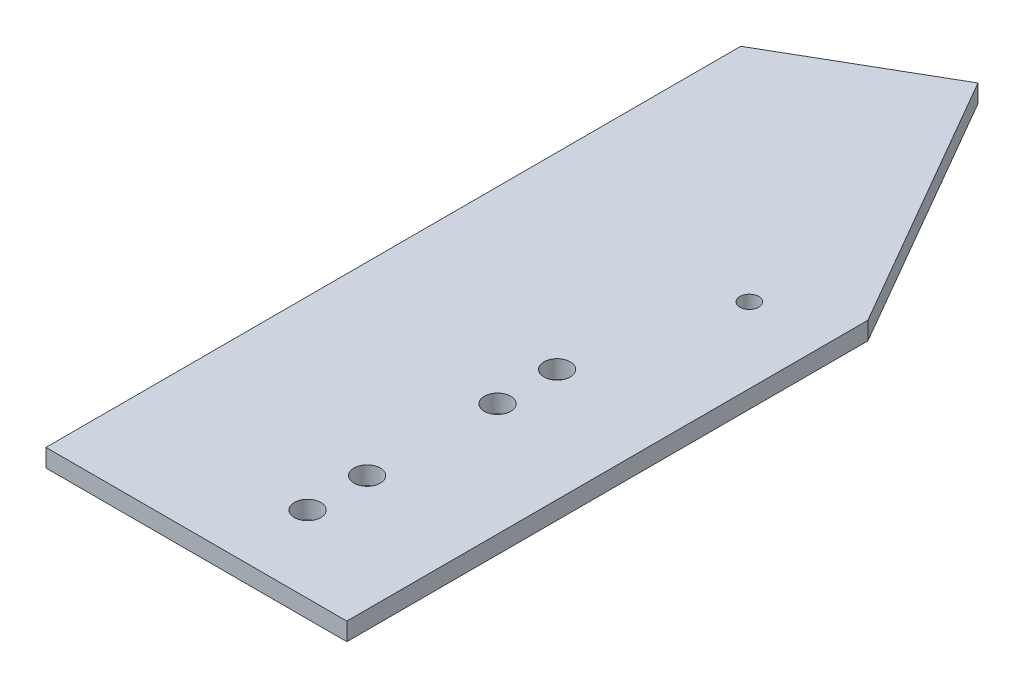
ISO-10303-21;
HEADER;
FILE_DESCRIPTION(('STEP AP214'),'2;1');
FILE_NAME('part.step','',(''),(''),'','','');
FILE_SCHEMA(('AUTOMOTIVE_DESIGN { 1 0 10303 214 1 1 1 1 }'));
ENDSEC;
DATA;
#1=APPLICATION_CONTEXT('core data for automotive mechanical design processes');
#2=APPLICATION_PROTOCOL_DEFINITION('international standard','automotive_design',2000,#1);
#3=PRODUCT_CONTEXT('',#1,'mechanical');
#4=PRODUCT('Part','Part','',(#3));
#5=PRODUCT_RELATED_PRODUCT_CATEGORY('part','',(#4));
#6=PRODUCT_DEFINITION_FORMATION('','',#4);
#7=PRODUCT_DEFINITION_CONTEXT('part definition',#1,'design');
#8=PRODUCT_DEFINITION('design','',#6,#7);
#9=PRODUCT_DEFINITION_SHAPE('','',#8);
#10=(LENGTH_UNIT() NAMED_UNIT(*) SI_UNIT(.MILLI.,.METRE.));
#11=(NAMED_UNIT(*) PLANE_ANGLE_UNIT() SI_UNIT($,.RADIAN.));
#12=(NAMED_UNIT(*) SI_UNIT($,.STERADIAN.) SOLID_ANGLE_UNIT());
#13=UNCERTAINTY_MEASURE_WITH_UNIT(LENGTH_MEASURE(1.E-05),#10,'distance_accuracy_value','');
#14=(GEOMETRIC_REPRESENTATION_CONTEXT(3) GLOBAL_UNCERTAINTY_ASSIGNED_CONTEXT((#13)) GLOBAL_UNIT_ASSIGNED_CONTEXT((#10,
#11,#12)) REPRESENTATION_CONTEXT('',''));
#15=CARTESIAN_POINT('',(0.,0.,0.));
#16=DIRECTION('',(0.,0.,1.));
#17=DIRECTION('',(1.,0.,0.));
#18=AXIS2_PLACEMENT_3D('',#15,#16,#17);
#19=CARTESIAN_POINT('',(-120.,1.19,0.));
#20=DIRECTION('',(1.,0.,0.));
#21=DIRECTION('',(0.,0.,-1.));
#22=AXIS2_PLACEMENT_3D('',#19,#20,#21);
#23=PLANE('',#22);
#24=DIRECTION('',(0.,0.,1.));
#25=VECTOR('',#24,1.);
#26=CARTESIAN_POINT('',(-120.,0.,0.));
#27=LINE('',#26,#25);
#28=CARTESIAN_POINT('',(-120.,0.,-101.691));
#29=VERTEX_POINT('',#28);
#30=CARTESIAN_POINT('',(-120.,0.,-55.5));
#31=VERTEX_POINT('',#30);
#32=EDGE_CURVE('E145',#29,#31,#27,.T.);
#33=ORIENTED_EDGE('',*,*,#32,.T.);
#34=DIRECTION('',(0.,-1.,0.));
#35=VECTOR('',#34,1.);
#36=CARTESIAN_POINT('',(-120.,1.19,-55.5));
#37=LINE('',#36,#35);
#38=CARTESIAN_POINT('',(-120.,1.19,-55.5));
#39=VERTEX_POINT('',#38);
#40=EDGE_CURVE('E11',#39,#31,#37,.T.);
#41=ORIENTED_EDGE('',*,*,#40,.F.);
#42=DIRECTION('',(0.,0.,1.));
#43=VECTOR('',#42,1.);
#44=CARTESIAN_POINT('',(-120.,1.19,0.));
#45=LINE('',#44,#43);
#46=CARTESIAN_POINT('',(-120.,1.19,-101.691));
#47=VERTEX_POINT('',#46);
#48=EDGE_CURVE('E169',#47,#39,#45,.T.);
#49=ORIENTED_EDGE('',*,*,#48,.F.);
#50=DIRECTION('',(0.,-1.,0.));
#51=VECTOR('',#50,1.);
#52=CARTESIAN_POINT('',(-120.,1.19,-101.691));
#53=LINE('',#52,#51);
#54=EDGE_CURVE('E121',#47,#29,#53,.T.);
#55=ORIENTED_EDGE('',*,*,#54,.T.);
#56=EDGE_LOOP('',(#33,#41,#49,#55));
#57=FACE_BOUND('',#56,.T.);
#58=ADVANCED_FACE('F45',(#57),#23,.F.);
#59=CARTESIAN_POINT('',(0.,1.19,-55.5));
#60=DIRECTION('',(0.,0.,-1.));
#61=DIRECTION('',(-1.,0.,0.));
#62=AXIS2_PLACEMENT_3D('',#59,#60,#61);
#63=PLANE('',#62);
#64=DIRECTION('',(1.,0.,0.));
#65=VECTOR('',#64,1.);
#66=CARTESIAN_POINT('',(0.,0.,-55.5));
#67=LINE('',#66,#65);
#68=CARTESIAN_POINT('',(-100.,0.,-55.5));
#69=VERTEX_POINT('',#68);
#70=EDGE_CURVE('E149',#31,#69,#67,.T.);
#71=ORIENTED_EDGE('',*,*,#70,.T.);
#72=DIRECTION('',(0.,-1.,0.));
#73=VECTOR('',#72,1.);
#74=CARTESIAN_POINT('',(-100.,1.19,-55.5));
#75=LINE('',#74,#73);
#76=CARTESIAN_POINT('',(-100.,1.19,-55.5));
#77=VERTEX_POINT('',#76);
#78=EDGE_CURVE('E55',#77,#69,#75,.T.);
#79=ORIENTED_EDGE('',*,*,#78,.F.);
#80=DIRECTION('',(1.,0.,0.));
#81=VECTOR('',#80,1.);
#82=CARTESIAN_POINT('',(0.,1.19,-55.5));
#83=LINE('',#82,#81);
#84=EDGE_CURVE('E97',#39,#77,#83,.T.);
#85=ORIENTED_EDGE('',*,*,#84,.F.);
#86=ORIENTED_EDGE('',*,*,#40,.T.);
#87=EDGE_LOOP('',(#71,#79,#85,#86));
#88=FACE_BOUND('',#87,.T.);
#89=ADVANCED_FACE('F184',(#88),#63,.F.);
#90=CARTESIAN_POINT('',(-100.,1.19,0.));
#91=DIRECTION('',(-1.,0.,0.));
#92=DIRECTION('',(0.,0.,1.));
#93=AXIS2_PLACEMENT_3D('',#90,#91,#92);
#94=PLANE('',#93);
#95=DIRECTION('',(0.,0.,-1.));
#96=VECTOR('',#95,1.);
#97=CARTESIAN_POINT('',(-100.,0.,0.));
#98=LINE('',#97,#96);
#99=CARTESIAN_POINT('',(-100.,0.,-90.144));
#100=VERTEX_POINT('',#99);
#101=EDGE_CURVE('E113',#69,#100,#98,.T.);
#102=ORIENTED_EDGE('',*,*,#101,.T.);
#103=DIRECTION('',(0.,-1.,0.));
#104=VECTOR('',#103,1.);
#105=CARTESIAN_POINT('',(-100.,1.19,-90.144));
#106=LINE('',#105,#104);
#107=CARTESIAN_POINT('',(-100.,1.19,-90.144));
#108=VERTEX_POINT('',#107);
#109=EDGE_CURVE('E110',#108,#100,#106,.T.);
#110=ORIENTED_EDGE('',*,*,#109,.F.);
#111=DIRECTION('',(0.,0.,-1.));
#112=VECTOR('',#111,1.);
#113=CARTESIAN_POINT('',(-100.,1.19,0.));
#114=LINE('',#113,#112);
#115=EDGE_CURVE('E101',#77,#108,#114,.T.);
#116=ORIENTED_EDGE('',*,*,#115,.F.);
#117=ORIENTED_EDGE('',*,*,#78,.T.);
#118=EDGE_LOOP('',(#102,#110,#116,#117));
#119=FACE_BOUND('',#118,.T.);
#120=ADVANCED_FACE('F111',(#119),#94,.F.);
#121=CARTESIAN_POINT('',(-35.9648304525399,1.19,20.7649136562009));
#122=DIRECTION('',(-0.866019052628739,0.,0.500011000363013));
#123=DIRECTION('',(0.500011000363013,0.,0.866019052628739));
#124=AXIS2_PLACEMENT_3D('',#121,#122,#123);
#125=PLANE('',#124);
#126=DIRECTION('',(-0.500011000363013,0.,-0.866019052628739));
#127=VECTOR('',#126,1.);
#128=CARTESIAN_POINT('',(-35.9648304525399,0.,20.7649136562009));
#129=LINE('',#128,#127);
#130=CARTESIAN_POINT('',(-110.,0.,-107.464));
#131=VERTEX_POINT('',#130);
#132=EDGE_CURVE('E83',#100,#131,#129,.T.);
#133=ORIENTED_EDGE('',*,*,#132,.T.);
#134=DIRECTION('',(0.,-1.,0.));
#135=VECTOR('',#134,1.);
#136=CARTESIAN_POINT('',(-110.,1.19,-107.464));
#137=LINE('',#136,#135);
#138=CARTESIAN_POINT('',(-110.,1.19,-107.464));
#139=VERTEX_POINT('',#138);
#140=EDGE_CURVE('E115',#139,#131,#137,.T.);
#141=ORIENTED_EDGE('',*,*,#140,.F.);
#142=DIRECTION('',(-0.500011000363013,0.,-0.866019052628739));
#143=VECTOR('',#142,1.);
#144=CARTESIAN_POINT('',(-35.9648304525399,1.19,20.7649136562009));
#145=LINE('',#144,#143);
#146=EDGE_CURVE('E105',#108,#139,#145,.T.);
#147=ORIENTED_EDGE('',*,*,#146,.F.);
#148=ORIENTED_EDGE('',*,*,#109,.T.);
#149=EDGE_LOOP('',(#133,#141,#147,#148));
#150=FACE_BOUND('',#149,.T.);
#151=ADVANCED_FACE('F117',(#150),#125,.F.);
#152=CARTESIAN_POINT('',(-107.7,1.19,-64.55));
#153=DIRECTION('',(0.,-1.,0.));
#154=DIRECTION('',(0.,0.,-1.));
#155=AXIS2_PLACEMENT_3D('',#152,#153,#154);
#156=CYLINDRICAL_SURFACE('',#155,0.875000000000005);
#157=CARTESIAN_POINT('',(-107.7,1.19,-64.55));
#158=DIRECTION('',(0.,1.,0.));
#159=DIRECTION('',(0.,0.,1.));
#160=AXIS2_PLACEMENT_3D('',#157,#158,#159);
#161=CIRCLE('',#160,0.875000000000005);
#162=CARTESIAN_POINT('',(-107.7,1.19,-63.675));
#163=VERTEX_POINT('',#162);
#164=EDGE_CURVE('E309',#163,#163,#161,.T.);
#165=ORIENTED_EDGE('',*,*,#164,.T.);
#166=EDGE_LOOP('',(#165));
#167=FACE_BOUND('',#166,.T.);
#168=CARTESIAN_POINT('',(-107.7,0.,-64.55));
#169=DIRECTION('',(0.,1.,0.));
#170=DIRECTION('',(0.,0.,1.));
#171=AXIS2_PLACEMENT_3D('',#168,#169,#170);
#172=CIRCLE('',#171,0.875000000000005);
#173=CARTESIAN_POINT('',(-107.7,0.,-63.675));
#174=VERTEX_POINT('',#173);
#175=EDGE_CURVE('E141',#174,#174,#172,.T.);
#176=ORIENTED_EDGE('',*,*,#175,.F.);
#177=EDGE_LOOP('',(#176));
#178=FACE_BOUND('',#177,.T.);
#179=ADVANCED_FACE('F192',(#167,#178),#156,.F.);
#180=CARTESIAN_POINT('',(-107.5,1.19,-76.98));
#181=DIRECTION('',(0.,-1.,0.));
#182=DIRECTION('',(0.,0.,-1.));
#183=AXIS2_PLACEMENT_3D('',#180,#181,#182);
#184=CYLINDRICAL_SURFACE('',#183,0.875000000000005);
#185=CARTESIAN_POINT('',(-107.5,1.19,-76.98));
#186=DIRECTION('',(0.,1.,0.));
#187=DIRECTION('',(0.,0.,1.));
#188=AXIS2_PLACEMENT_3D('',#185,#186,#187);
#189=CIRCLE('',#188,0.875000000000005);
#190=CARTESIAN_POINT('',(-107.5,1.19,-76.105));
#191=VERTEX_POINT('',#190);
#192=EDGE_CURVE('E301',#191,#191,#189,.T.);
#193=ORIENTED_EDGE('',*,*,#192,.T.);
#194=EDGE_LOOP('',(#193));
#195=FACE_BOUND('',#194,.T.);
#196=CARTESIAN_POINT('',(-107.5,0.,-76.98));
#197=DIRECTION('',(0.,1.,0.));
#198=DIRECTION('',(0.,0.,1.));
#199=AXIS2_PLACEMENT_3D('',#196,#197,#198);
#200=CIRCLE('',#199,0.875000000000005);
#201=CARTESIAN_POINT('',(-107.5,0.,-76.105));
#202=VERTEX_POINT('',#201);
#203=EDGE_CURVE('E137',#202,#202,#200,.T.);
#204=ORIENTED_EDGE('',*,*,#203,.F.);
#205=EDGE_LOOP('',(#204));
#206=FACE_BOUND('',#205,.T.);
#207=ADVANCED_FACE('F195',(#195,#206),#184,.F.);
#208=CARTESIAN_POINT('',(-107.7,1.19,-60.59));
#209=DIRECTION('',(0.,-1.,0.));
#210=DIRECTION('',(0.,0.,-1.));
#211=AXIS2_PLACEMENT_3D('',#208,#209,#210);
#212=CYLINDRICAL_SURFACE('',#211,0.875000000000005);
#213=CARTESIAN_POINT('',(-107.7,1.19,-60.59));
#214=DIRECTION('',(0.,1.,0.));
#215=DIRECTION('',(0.,0.,1.));
#216=AXIS2_PLACEMENT_3D('',#213,#214,#215);
#217=CIRCLE('',#216,0.875000000000005);
#218=CARTESIAN_POINT('',(-107.7,1.19,-59.715));
#219=VERTEX_POINT('',#218);
#220=EDGE_CURVE('E296',#219,#219,#217,.T.);
#221=ORIENTED_EDGE('',*,*,#220,.T.);
#222=EDGE_LOOP('',(#221));
#223=FACE_BOUND('',#222,.T.);
#224=CARTESIAN_POINT('',(-107.7,0.,-60.59));
#225=DIRECTION('',(0.,1.,0.));
#226=DIRECTION('',(0.,0.,1.));
#227=AXIS2_PLACEMENT_3D('',#224,#225,#226);
#228=CIRCLE('',#227,0.875000000000005);
#229=CARTESIAN_POINT('',(-107.7,0.,-59.715));
#230=VERTEX_POINT('',#229);
#231=EDGE_CURVE('E133',#230,#230,#228,.T.);
#232=ORIENTED_EDGE('',*,*,#231,.F.);
#233=EDGE_LOOP('',(#232));
#234=FACE_BOUND('',#233,.T.);
#235=ADVANCED_FACE('F199',(#223,#234),#212,.F.);
#236=CARTESIAN_POINT('',(-105.,1.19,-87.26));
#237=DIRECTION('',(0.,-1.,0.));
#238=DIRECTION('',(0.,0.,-1.));
#239=AXIS2_PLACEMENT_3D('',#236,#237,#238);
#240=CYLINDRICAL_SURFACE('',#239,0.625000000000006);
#241=CARTESIAN_POINT('',(-105.,1.19,-87.26));
#242=DIRECTION('',(0.,1.,0.));
#243=DIRECTION('',(0.,0.,1.));
#244=AXIS2_PLACEMENT_3D('',#241,#242,#243);
#245=CIRCLE('',#244,0.625000000000006);
#246=CARTESIAN_POINT('',(-105.,1.19,-86.635));
#247=VERTEX_POINT('',#246);
#248=EDGE_CURVE('E210',#247,#247,#245,.T.);
#249=ORIENTED_EDGE('',*,*,#248,.T.);
#250=EDGE_LOOP('',(#249));
#251=FACE_BOUND('',#250,.T.);
#252=CARTESIAN_POINT('',(-105.,0.,-87.26));
#253=DIRECTION('',(0.,1.,0.));
#254=DIRECTION('',(0.,0.,1.));
#255=AXIS2_PLACEMENT_3D('',#252,#253,#254);
#256=CIRCLE('',#255,0.625000000000006);
#257=CARTESIAN_POINT('',(-105.,0.,-86.635));
#258=VERTEX_POINT('',#257);
#259=EDGE_CURVE('E129',#258,#258,#256,.T.);
#260=ORIENTED_EDGE('',*,*,#259,.F.);
#261=EDGE_LOOP('',(#260));
#262=FACE_BOUND('',#261,.T.);
#263=ADVANCED_FACE('F179',(#251,#262),#240,.F.);
#264=CARTESIAN_POINT('',(-107.5,1.19,-73.02));
#265=DIRECTION('',(0.,-1.,0.));
#266=DIRECTION('',(0.,0.,-1.));
#267=AXIS2_PLACEMENT_3D('',#264,#265,#266);
#268=CYLINDRICAL_SURFACE('',#267,0.875000000000005);
#269=CARTESIAN_POINT('',(-107.5,1.19,-73.02));
#270=DIRECTION('',(0.,1.,0.));
#271=DIRECTION('',(0.,0.,1.));
#272=AXIS2_PLACEMENT_3D('',#269,#270,#271);
#273=CIRCLE('',#272,0.875000000000005);
#274=CARTESIAN_POINT('',(-107.5,1.19,-72.145));
#275=VERTEX_POINT('',#274);
#276=EDGE_CURVE('E158',#275,#275,#273,.T.);
#277=ORIENTED_EDGE('',*,*,#276,.T.);
#278=EDGE_LOOP('',(#277));
#279=FACE_BOUND('',#278,.T.);
#280=CARTESIAN_POINT('',(-107.5,0.,-73.02));
#281=DIRECTION('',(0.,1.,0.));
#282=DIRECTION('',(0.,0.,1.));
#283=AXIS2_PLACEMENT_3D('',#280,#281,#282);
#284=CIRCLE('',#283,0.875000000000005);
#285=CARTESIAN_POINT('',(-107.5,0.,-72.145));
#286=VERTEX_POINT('',#285);
#287=EDGE_CURVE('E125',#286,#286,#284,.T.);
#288=ORIENTED_EDGE('',*,*,#287,.F.);
#289=EDGE_LOOP('',(#288));
#290=FACE_BOUND('',#289,.T.);
#291=ADVANCED_FACE('F47',(#279,#290),#268,.F.);
#292=CARTESIAN_POINT('',(-74.0276594340843,1.19,-128.230832208703));
#293=DIRECTION('',(0.499967348137485,0.,0.866044254525351));
#294=DIRECTION('',(0.866044254525351,0.,-0.499967348137485));
#295=AXIS2_PLACEMENT_3D('',#292,#293,#294);
#296=PLANE('',#295);
#297=DIRECTION('',(-0.866044254525351,0.,0.499967348137485));
#298=VECTOR('',#297,1.);
#299=CARTESIAN_POINT('',(-74.0276594340843,0.,-128.230832208703));
#300=LINE('',#299,#298);
#301=EDGE_CURVE('E89',#131,#29,#300,.T.);
#302=ORIENTED_EDGE('',*,*,#301,.T.);
#303=ORIENTED_EDGE('',*,*,#54,.F.);
#304=DIRECTION('',(-0.866044254525351,0.,0.499967348137485));
#305=VECTOR('',#304,1.);
#306=CARTESIAN_POINT('',(-74.0276594340843,1.19,-128.230832208703));
#307=LINE('',#306,#305);
#308=EDGE_CURVE('E63',#139,#47,#307,.T.);
#309=ORIENTED_EDGE('',*,*,#308,.F.);
#310=ORIENTED_EDGE('',*,*,#140,.T.);
#311=EDGE_LOOP('',(#302,#303,#309,#310));
#312=FACE_BOUND('',#311,.T.);
#313=ADVANCED_FACE('F170',(#312),#296,.F.);
#314=CARTESIAN_POINT('',(0.,1.19,0.));
#315=DIRECTION('',(0.,1.,0.));
#316=DIRECTION('',(0.,0.,1.));
#317=AXIS2_PLACEMENT_3D('',#314,#315,#316);
#318=PLANE('',#317);
#319=ORIENTED_EDGE('',*,*,#276,.F.);
#320=EDGE_LOOP('',(#319));
#321=FACE_BOUND('',#320,.T.);
#322=ORIENTED_EDGE('',*,*,#248,.F.);
#323=EDGE_LOOP('',(#322));
#324=FACE_BOUND('',#323,.T.);
#325=ORIENTED_EDGE('',*,*,#220,.F.);
#326=EDGE_LOOP('',(#325));
#327=FACE_BOUND('',#326,.T.);
#328=ORIENTED_EDGE('',*,*,#192,.F.);
#329=EDGE_LOOP('',(#328));
#330=FACE_BOUND('',#329,.T.);
#331=ORIENTED_EDGE('',*,*,#164,.F.);
#332=EDGE_LOOP('',(#331));
#333=FACE_BOUND('',#332,.T.);
#334=ORIENTED_EDGE('',*,*,#48,.T.);
#335=ORIENTED_EDGE('',*,*,#84,.T.);
#336=ORIENTED_EDGE('',*,*,#115,.T.);
#337=ORIENTED_EDGE('',*,*,#146,.T.);
#338=ORIENTED_EDGE('',*,*,#308,.T.);
#339=EDGE_LOOP('',(#334,#335,#336,#337,#338));
#340=FACE_BOUND('',#339,.T.);
#341=ADVANCED_FACE('F103',(#321,#324,#327,#330,#333,#340),#318,.T.);
#342=CARTESIAN_POINT('',(0.,0.,0.));
#343=DIRECTION('',(0.,1.,0.));
#344=DIRECTION('',(0.,0.,1.));
#345=AXIS2_PLACEMENT_3D('',#342,#343,#344);
#346=PLANE('',#345);
#347=ORIENTED_EDGE('',*,*,#287,.T.);
#348=EDGE_LOOP('',(#347));
#349=FACE_BOUND('',#348,.T.);
#350=ORIENTED_EDGE('',*,*,#259,.T.);
#351=EDGE_LOOP('',(#350));
#352=FACE_BOUND('',#351,.T.);
#353=ORIENTED_EDGE('',*,*,#231,.T.);
#354=EDGE_LOOP('',(#353));
#355=FACE_BOUND('',#354,.T.);
#356=ORIENTED_EDGE('',*,*,#203,.T.);
#357=EDGE_LOOP('',(#356));
#358=FACE_BOUND('',#357,.T.);
#359=ORIENTED_EDGE('',*,*,#175,.T.);
#360=EDGE_LOOP('',(#359));
#361=FACE_BOUND('',#360,.T.);
#362=ORIENTED_EDGE('',*,*,#32,.F.);
#363=ORIENTED_EDGE('',*,*,#301,.F.);
#364=ORIENTED_EDGE('',*,*,#132,.F.);
#365=ORIENTED_EDGE('',*,*,#101,.F.);
#366=ORIENTED_EDGE('',*,*,#70,.F.);
#367=EDGE_LOOP('',(#362,#363,#364,#365,#366));
#368=FACE_BOUND('',#367,.T.);
#369=ADVANCED_FACE('F165',(#349,#352,#355,#358,#361,#368),#346,.F.);
#370=CLOSED_SHELL('',(#58,#89,#120,#151,#179,#207,#235,#263,#291,#313,#341,#369));
#371=MANIFOLD_SOLID_BREP('B2',#370);
#372=ADVANCED_BREP_SHAPE_REPRESENTATION('',(#18,#371),#14);
#373=SHAPE_DEFINITION_REPRESENTATION(#9,#372);
ENDSEC;
END-ISO-10303-21;
